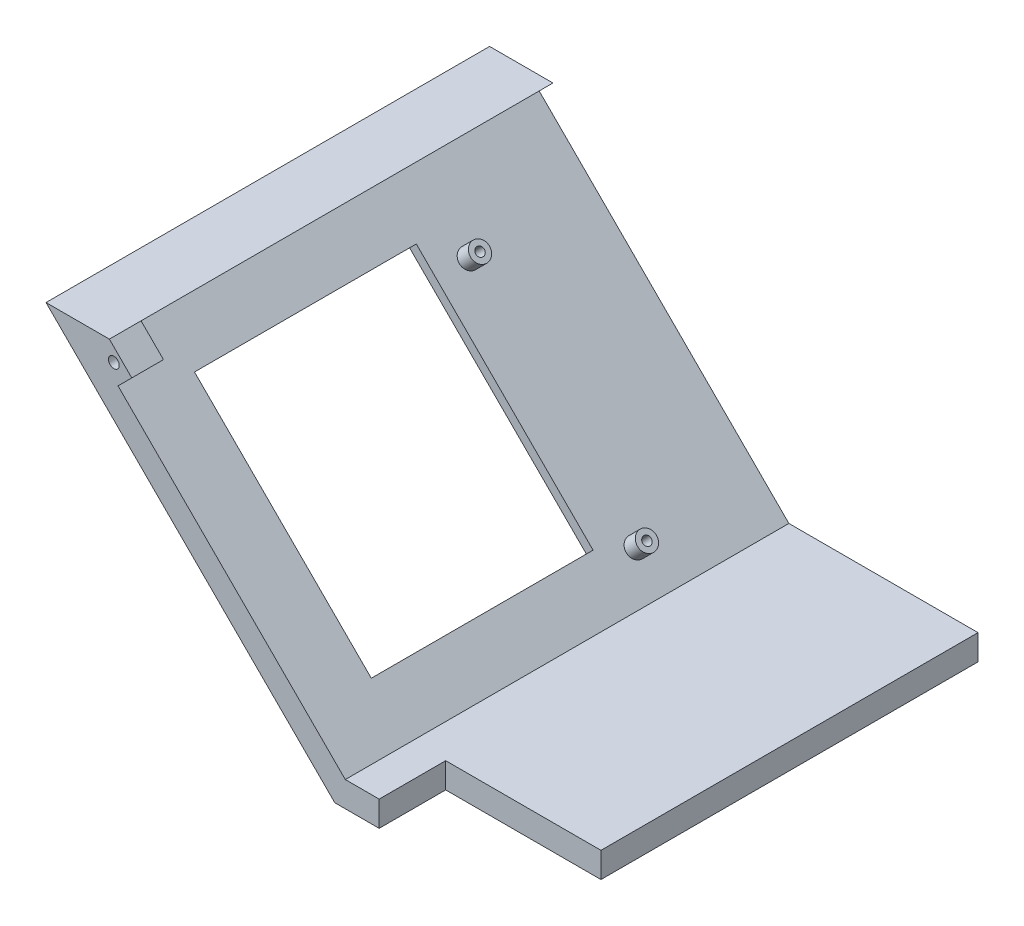
ISO-10303-21;
HEADER;
FILE_DESCRIPTION(('STEP AP214'),'2;1');
FILE_NAME('part.step','',(''),(''),'','','');
FILE_SCHEMA(('AUTOMOTIVE_DESIGN { 1 0 10303 214 1 1 1 1 }'));
ENDSEC;
DATA;
#1=APPLICATION_CONTEXT('core data for automotive mechanical design processes');
#2=APPLICATION_PROTOCOL_DEFINITION('international standard','automotive_design',2000,#1);
#3=PRODUCT_CONTEXT('',#1,'mechanical');
#4=PRODUCT('Part','Part','',(#3));
#5=PRODUCT_RELATED_PRODUCT_CATEGORY('part','',(#4));
#6=PRODUCT_DEFINITION_FORMATION('','',#4);
#7=PRODUCT_DEFINITION_CONTEXT('part definition',#1,'design');
#8=PRODUCT_DEFINITION('design','',#6,#7);
#9=PRODUCT_DEFINITION_SHAPE('','',#8);
#10=(LENGTH_UNIT() NAMED_UNIT(*) SI_UNIT(.MILLI.,.METRE.));
#11=(NAMED_UNIT(*) PLANE_ANGLE_UNIT() SI_UNIT($,.RADIAN.));
#12=(NAMED_UNIT(*) SI_UNIT($,.STERADIAN.) SOLID_ANGLE_UNIT());
#13=UNCERTAINTY_MEASURE_WITH_UNIT(LENGTH_MEASURE(1.E-05),#10,'distance_accuracy_value','');
#14=(GEOMETRIC_REPRESENTATION_CONTEXT(3) GLOBAL_UNCERTAINTY_ASSIGNED_CONTEXT((#13)) GLOBAL_UNIT_ASSIGNED_CONTEXT((#10,
#11,#12)) REPRESENTATION_CONTEXT('',''));
#15=CARTESIAN_POINT('',(0.,0.,0.));
#16=DIRECTION('',(0.,0.,1.));
#17=DIRECTION('',(1.,0.,0.));
#18=AXIS2_PLACEMENT_3D('',#15,#16,#17);
#19=CARTESIAN_POINT('',(0.,0.,130.));
#20=DIRECTION('',(0.,0.,1.));
#21=DIRECTION('',(1.,0.,0.));
#22=AXIS2_PLACEMENT_3D('',#19,#20,#21);
#23=PLANE('',#22);
#24=DIRECTION('',(-0.707106781186548,0.707106781186547,0.));
#25=VECTOR('',#24,1.);
#26=CARTESIAN_POINT('',(-127.078932188135,84.0789321881348,130.));
#27=LINE('',#26,#25);
#28=CARTESIAN_POINT('',(-130.614466094067,87.6144660940676,130.));
#29=VERTEX_POINT('',#28);
#30=CARTESIAN_POINT('',(-134.15,91.1500000000003,130.));
#31=VERTEX_POINT('',#30);
#32=EDGE_CURVE('E254',#29,#31,#27,.T.);
#33=ORIENTED_EDGE('',*,*,#32,.F.);
#34=CARTESIAN_POINT('',(-132.735786437627,85.4931457505079,130.));
#35=DIRECTION('',(0.,0.,-1.));
#36=DIRECTION('',(-1.,0.,0.));
#37=AXIS2_PLACEMENT_3D('',#34,#35,#36);
#38=CIRCLE('',#37,3.);
#39=EDGE_CURVE('E241',#29,#29,#38,.T.);
#40=ORIENTED_EDGE('',*,*,#39,.F.);
#41=CARTESIAN_POINT('',(-127.078932188135,84.0789321881348,130.));
#42=VERTEX_POINT('',#41);
#43=EDGE_CURVE('E250',#42,#29,#27,.T.);
#44=ORIENTED_EDGE('',*,*,#43,.F.);
#45=DIRECTION('',(0.707106781186549,0.707106781186546,0.));
#46=VECTOR('',#45,1.);
#47=CARTESIAN_POINT('',(-131.422077938642,79.7357864376271,130.));
#48=LINE('',#47,#46);
#49=CARTESIAN_POINT('',(-131.422077938642,79.7357864376271,130.));
#50=VERTEX_POINT('',#49);
#51=EDGE_CURVE('E260',#50,#42,#48,.T.);
#52=ORIENTED_EDGE('',*,*,#51,.F.);
#53=DIRECTION('',(0.707106781186534,-0.707106781186561,0.));
#54=VECTOR('',#53,1.);
#55=CARTESIAN_POINT('',(-138.493145750508,86.8068542494927,130.));
#56=LINE('',#55,#54);
#57=CARTESIAN_POINT('',(-138.493145750508,86.8068542494927,130.));
#58=VERTEX_POINT('',#57);
#59=EDGE_CURVE('E257',#58,#50,#56,.T.);
#60=ORIENTED_EDGE('',*,*,#59,.F.);
#61=DIRECTION('',(-0.707106781186544,-0.707106781186551,0.));
#62=VECTOR('',#61,1.);
#63=CARTESIAN_POINT('',(-134.15,91.1500000000003,130.));
#64=LINE('',#63,#62);
#65=EDGE_CURVE('E253',#31,#58,#64,.T.);
#66=ORIENTED_EDGE('',*,*,#65,.F.);
#67=EDGE_LOOP('',(#33,#40,#44,#52,#60,#66));
#68=FACE_BOUND('',#67,.T.);
#69=ADVANCED_FACE('F32',(#68),#23,.F.);
#70=CARTESIAN_POINT('',(-134.15,91.1500000000003,140.));
#71=DIRECTION('',(-0.707106781186551,0.707106781186544,0.));
#72=DIRECTION('',(-0.707106781186544,-0.707106781186551,0.));
#73=AXIS2_PLACEMENT_3D('',#70,#71,#72);
#74=PLANE('',#73);
#75=ORIENTED_EDGE('',*,*,#65,.T.);
#76=DIRECTION('',(0.,0.,-1.));
#77=VECTOR('',#76,1.);
#78=CARTESIAN_POINT('',(-138.493145750508,86.8068542494927,140.));
#79=LINE('',#78,#77);
#80=CARTESIAN_POINT('',(-138.493145750508,86.8068542494927,0.));
#81=VERTEX_POINT('',#80);
#82=EDGE_CURVE('E325',#58,#81,#79,.T.);
#83=ORIENTED_EDGE('',*,*,#82,.T.);
#84=DIRECTION('',(0.707106781186544,0.707106781186551,0.));
#85=VECTOR('',#84,1.);
#86=CARTESIAN_POINT('',(-134.15,91.1500000000003,0.));
#87=LINE('',#86,#85);
#88=CARTESIAN_POINT('',(-134.15,91.1500000000003,0.));
#89=VERTEX_POINT('',#88);
#90=EDGE_CURVE('E310',#81,#89,#87,.T.);
#91=ORIENTED_EDGE('',*,*,#90,.T.);
#92=DIRECTION('',(0.,0.,-1.));
#93=VECTOR('',#92,1.);
#94=CARTESIAN_POINT('',(-134.15,91.1500000000003,140.));
#95=LINE('',#94,#93);
#96=EDGE_CURVE('E321',#31,#89,#95,.T.);
#97=ORIENTED_EDGE('',*,*,#96,.F.);
#98=EDGE_LOOP('',(#75,#83,#91,#97));
#99=FACE_BOUND('',#98,.T.);
#100=ADVANCED_FACE('F362',(#99),#74,.F.);
#101=CARTESIAN_POINT('',(-63.,0.,140.));
#102=DIRECTION('',(0.,1.,0.));
#103=DIRECTION('',(0.,0.,1.));
#104=AXIS2_PLACEMENT_3D('',#101,#102,#103);
#105=PLANE('',#104);
#106=DIRECTION('',(0.,0.,-1.));
#107=VECTOR('',#106,1.);
#108=CARTESIAN_POINT('',(0.,0.,140.));
#109=LINE('',#108,#107);
#110=CARTESIAN_POINT('',(0.,0.,119.));
#111=VERTEX_POINT('',#110);
#112=CARTESIAN_POINT('',(0.,0.,0.));
#113=VERTEX_POINT('',#112);
#114=EDGE_CURVE('E332',#111,#113,#109,.T.);
#115=ORIENTED_EDGE('',*,*,#114,.F.);
#116=DIRECTION('',(1.,0.,0.));
#117=VECTOR('',#116,1.);
#118=CARTESIAN_POINT('',(0.,0.,119.));
#119=LINE('',#118,#117);
#120=CARTESIAN_POINT('',(-49.,0.,119.));
#121=VERTEX_POINT('',#120);
#122=EDGE_CURVE('E275',#121,#111,#119,.T.);
#123=ORIENTED_EDGE('',*,*,#122,.F.);
#124=DIRECTION('',(0.,0.,-1.));
#125=VECTOR('',#124,1.);
#126=CARTESIAN_POINT('',(-49.,0.,140.));
#127=LINE('',#126,#125);
#128=CARTESIAN_POINT('',(-49.,0.,140.));
#129=VERTEX_POINT('',#128);
#130=EDGE_CURVE('E270',#129,#121,#127,.T.);
#131=ORIENTED_EDGE('',*,*,#130,.F.);
#132=DIRECTION('',(1.,0.,0.));
#133=VECTOR('',#132,1.);
#134=CARTESIAN_POINT('',(-63.,0.,140.));
#135=LINE('',#134,#133);
#136=CARTESIAN_POINT('',(-63.,0.,140.));
#137=VERTEX_POINT('',#136);
#138=EDGE_CURVE('E286',#137,#129,#135,.T.);
#139=ORIENTED_EDGE('',*,*,#138,.F.);
#140=DIRECTION('',(0.,0.,-1.));
#141=VECTOR('',#140,1.);
#142=CARTESIAN_POINT('',(-63.,0.,140.));
#143=LINE('',#142,#141);
#144=CARTESIAN_POINT('',(-63.,0.,0.));
#145=VERTEX_POINT('',#144);
#146=EDGE_CURVE('E299',#137,#145,#143,.T.);
#147=ORIENTED_EDGE('',*,*,#146,.T.);
#148=DIRECTION('',(1.,0.,0.));
#149=VECTOR('',#148,1.);
#150=CARTESIAN_POINT('',(-63.,0.,0.));
#151=LINE('',#150,#149);
#152=EDGE_CURVE('E285',#145,#113,#151,.T.);
#153=ORIENTED_EDGE('',*,*,#152,.T.);
#154=EDGE_LOOP('',(#115,#123,#131,#139,#147,#153));
#155=FACE_BOUND('',#154,.T.);
#156=ADVANCED_FACE('F34',(#155),#105,.F.);
#157=CARTESIAN_POINT('',(0.,0.,140.));
#158=DIRECTION('',(-1.,0.,0.));
#159=DIRECTION('',(0.,0.,1.));
#160=AXIS2_PLACEMENT_3D('',#157,#158,#159);
#161=PLANE('',#160);
#162=DIRECTION('',(0.,0.,-1.));
#163=VECTOR('',#162,1.);
#164=CARTESIAN_POINT('',(0.,8.,140.));
#165=LINE('',#164,#163);
#166=CARTESIAN_POINT('',(0.,7.99999999999999,119.));
#167=VERTEX_POINT('',#166);
#168=CARTESIAN_POINT('',(0.,8.,0.));
#169=VERTEX_POINT('',#168);
#170=EDGE_CURVE('E330',#167,#169,#165,.T.);
#171=ORIENTED_EDGE('',*,*,#170,.F.);
#172=DIRECTION('',(0.,-1.,0.));
#173=VECTOR('',#172,1.);
#174=CARTESIAN_POINT('',(0.,91.1500000000003,119.));
#175=LINE('',#174,#173);
#176=EDGE_CURVE('E278',#167,#111,#175,.T.);
#177=ORIENTED_EDGE('',*,*,#176,.T.);
#178=ORIENTED_EDGE('',*,*,#114,.T.);
#179=DIRECTION('',(0.,1.,0.));
#180=VECTOR('',#179,1.);
#181=CARTESIAN_POINT('',(0.,0.,0.));
#182=LINE('',#181,#180);
#183=EDGE_CURVE('E302',#113,#169,#182,.T.);
#184=ORIENTED_EDGE('',*,*,#183,.T.);
#185=EDGE_LOOP('',(#171,#177,#178,#184));
#186=FACE_BOUND('',#185,.T.);
#187=ADVANCED_FACE('F427',(#186),#161,.F.);
#188=CARTESIAN_POINT('',(0.,8.,140.));
#189=DIRECTION('',(0.,-1.,0.));
#190=DIRECTION('',(1.,0.,0.));
#191=AXIS2_PLACEMENT_3D('',#188,#189,#190);
#192=PLANE('',#191);
#193=DIRECTION('',(0.,0.,-1.));
#194=VECTOR('',#193,1.);
#195=CARTESIAN_POINT('',(-49.,7.99999999999999,140.));
#196=LINE('',#195,#194);
#197=CARTESIAN_POINT('',(-49.,7.99999999999999,140.));
#198=VERTEX_POINT('',#197);
#199=CARTESIAN_POINT('',(-49.,7.99999999999999,119.));
#200=VERTEX_POINT('',#199);
#201=EDGE_CURVE('E281',#198,#200,#196,.T.);
#202=ORIENTED_EDGE('',*,*,#201,.T.);
#203=DIRECTION('',(1.,0.,0.));
#204=VECTOR('',#203,1.);
#205=CARTESIAN_POINT('',(0.,8.,119.));
#206=LINE('',#205,#204);
#207=EDGE_CURVE('E336',#200,#167,#206,.T.);
#208=ORIENTED_EDGE('',*,*,#207,.T.);
#209=ORIENTED_EDGE('',*,*,#170,.T.);
#210=DIRECTION('',(-1.,0.,0.));
#211=VECTOR('',#210,1.);
#212=CARTESIAN_POINT('',(0.,8.,0.));
#213=LINE('',#212,#211);
#214=CARTESIAN_POINT('',(-59.6862915010152,7.99999999999999,0.));
#215=VERTEX_POINT('',#214);
#216=EDGE_CURVE('E305',#169,#215,#213,.T.);
#217=ORIENTED_EDGE('',*,*,#216,.T.);
#218=DIRECTION('',(0.,0.,-1.));
#219=VECTOR('',#218,1.);
#220=CARTESIAN_POINT('',(-59.6862915010152,7.99999999999999,140.));
#221=LINE('',#220,#219);
#222=CARTESIAN_POINT('',(-59.6862915010152,7.99999999999999,140.));
#223=VERTEX_POINT('',#222);
#224=EDGE_CURVE('E327',#223,#215,#221,.T.);
#225=ORIENTED_EDGE('',*,*,#224,.F.);
#226=DIRECTION('',(-1.,0.,0.));
#227=VECTOR('',#226,1.);
#228=CARTESIAN_POINT('',(0.,8.,140.));
#229=LINE('',#228,#227);
#230=EDGE_CURVE('E289',#198,#223,#229,.T.);
#231=ORIENTED_EDGE('',*,*,#230,.F.);
#232=EDGE_LOOP('',(#202,#208,#209,#217,#225,#231));
#233=FACE_BOUND('',#232,.T.);
#234=ADVANCED_FACE('F349',(#233),#192,.F.);
#235=CARTESIAN_POINT('',(-59.6862915010152,7.99999999999999,140.));
#236=DIRECTION('',(-0.707106781186549,-0.707106781186546,0.));
#237=DIRECTION('',(0.707106781186546,-0.707106781186549,0.));
#238=AXIS2_PLACEMENT_3D('',#235,#236,#237);
#239=PLANE('',#238);
#240=CARTESIAN_POINT('',(-121.204581464245,69.5182899632297,39.5));
#241=DIRECTION('',(-0.707106781186549,-0.707106781186546,0.));
#242=DIRECTION('',(0.707106781186546,-0.707106781186549,0.));
#243=AXIS2_PLACEMENT_3D('',#240,#241,#242);
#244=CIRCLE('',#243,3.);
#245=CARTESIAN_POINT('',(-119.083261120685,67.3969696196701,39.5));
#246=VERTEX_POINT('',#245);
#247=EDGE_CURVE('E11',#246,#246,#244,.F.);
#248=ORIENTED_EDGE('',*,*,#247,.F.);
#249=EDGE_LOOP('',(#248));
#250=FACE_BOUND('',#249,.T.);
#251=CARTESIAN_POINT('',(-68.525126265847,16.8388347648318,39.5));
#252=DIRECTION('',(-0.707106781186549,-0.707106781186546,0.));
#253=DIRECTION('',(0.707106781186546,-0.707106781186549,0.));
#254=AXIS2_PLACEMENT_3D('',#251,#252,#253);
#255=CIRCLE('',#254,3.);
#256=CARTESIAN_POINT('',(-66.4038059222874,14.7175144212722,39.5));
#257=VERTEX_POINT('',#256);
#258=EDGE_CURVE('E40',#257,#257,#255,.F.);
#259=ORIENTED_EDGE('',*,*,#258,.F.);
#260=EDGE_LOOP('',(#259));
#261=FACE_BOUND('',#260,.T.);
#262=DIRECTION('',(0.,0.,1.));
#263=VECTOR('',#262,1.);
#264=CARTESIAN_POINT('',(-71.4852813742385,19.7989898732234,140.));
#265=LINE('',#264,#263);
#266=CARTESIAN_POINT('',(-71.4852813742385,19.7989898732233,50.));
#267=VERTEX_POINT('',#266);
#268=CARTESIAN_POINT('',(-71.4852813742385,19.7989898732233,120.));
#269=VERTEX_POINT('',#268);
#270=EDGE_CURVE('E235',#267,#269,#265,.T.);
#271=ORIENTED_EDGE('',*,*,#270,.T.);
#272=DIRECTION('',(-0.707106781186546,0.707106781186549,0.));
#273=VECTOR('',#272,1.);
#274=CARTESIAN_POINT('',(-59.6862915010152,7.99999999999999,120.));
#275=LINE('',#274,#273);
#276=CARTESIAN_POINT('',(-127.279942314911,75.5936508138962,120.));
#277=VERTEX_POINT('',#276);
#278=EDGE_CURVE('E238',#269,#277,#275,.T.);
#279=ORIENTED_EDGE('',*,*,#278,.T.);
#280=DIRECTION('',(0.,0.,-1.));
#281=VECTOR('',#280,1.);
#282=CARTESIAN_POINT('',(-127.279942314911,75.5936508138962,140.));
#283=LINE('',#282,#281);
#284=CARTESIAN_POINT('',(-127.279942314911,75.5936508138962,50.));
#285=VERTEX_POINT('',#284);
#286=EDGE_CURVE('E221',#277,#285,#283,.T.);
#287=ORIENTED_EDGE('',*,*,#286,.T.);
#288=DIRECTION('',(0.707106781186546,-0.707106781186549,0.));
#289=VECTOR('',#288,1.);
#290=CARTESIAN_POINT('',(-59.6862915010152,7.99999999999998,50.));
#291=LINE('',#290,#289);
#292=EDGE_CURVE('E232',#285,#267,#291,.T.);
#293=ORIENTED_EDGE('',*,*,#292,.T.);
#294=EDGE_LOOP('',(#271,#279,#287,#293));
#295=FACE_BOUND('',#294,.T.);
#296=ORIENTED_EDGE('',*,*,#59,.T.);
#297=DIRECTION('',(0.,0.,1.));
#298=VECTOR('',#297,1.);
#299=CARTESIAN_POINT('',(-131.422077938642,79.7357864376271,130.));
#300=LINE('',#299,#298);
#301=CARTESIAN_POINT('',(-131.422077938642,79.7357864376271,140.));
#302=VERTEX_POINT('',#301);
#303=EDGE_CURVE('E263',#50,#302,#300,.T.);
#304=ORIENTED_EDGE('',*,*,#303,.T.);
#305=DIRECTION('',(-0.707106781186546,0.707106781186549,0.));
#306=VECTOR('',#305,1.);
#307=CARTESIAN_POINT('',(-59.6862915010152,7.99999999999999,140.));
#308=LINE('',#307,#306);
#309=EDGE_CURVE('E292',#223,#302,#308,.T.);
#310=ORIENTED_EDGE('',*,*,#309,.F.);
#311=ORIENTED_EDGE('',*,*,#224,.T.);
#312=DIRECTION('',(-0.707106781186546,0.707106781186549,0.));
#313=VECTOR('',#312,1.);
#314=CARTESIAN_POINT('',(-59.6862915010152,7.99999999999999,0.));
#315=LINE('',#314,#313);
#316=EDGE_CURVE('E307',#215,#81,#315,.T.);
#317=ORIENTED_EDGE('',*,*,#316,.T.);
#318=ORIENTED_EDGE('',*,*,#82,.F.);
#319=EDGE_LOOP('',(#296,#304,#310,#311,#317,#318));
#320=FACE_BOUND('',#319,.T.);
#321=ADVANCED_FACE('F345',(#250,#261,#295,#320),#239,.F.);
#322=CARTESIAN_POINT('',(-154.15,91.1500000000003,140.));
#323=DIRECTION('',(0.,-1.,0.));
#324=DIRECTION('',(1.,0.,0.));
#325=AXIS2_PLACEMENT_3D('',#322,#323,#324);
#326=PLANE('',#325);
#327=DIRECTION('',(-1.,0.,0.));
#328=VECTOR('',#327,1.);
#329=CARTESIAN_POINT('',(-154.15,91.1500000000003,0.));
#330=LINE('',#329,#328);
#331=CARTESIAN_POINT('',(-154.15,91.1500000000003,0.));
#332=VERTEX_POINT('',#331);
#333=EDGE_CURVE('E313',#89,#332,#330,.T.);
#334=ORIENTED_EDGE('',*,*,#333,.T.);
#335=DIRECTION('',(0.,0.,-1.));
#336=VECTOR('',#335,1.);
#337=CARTESIAN_POINT('',(-154.15,91.1500000000003,140.));
#338=LINE('',#337,#336);
#339=CARTESIAN_POINT('',(-154.15,91.1500000000003,140.));
#340=VERTEX_POINT('',#339);
#341=EDGE_CURVE('E318',#340,#332,#338,.T.);
#342=ORIENTED_EDGE('',*,*,#341,.F.);
#343=DIRECTION('',(-1.,0.,0.));
#344=VECTOR('',#343,1.);
#345=CARTESIAN_POINT('',(-154.15,91.1500000000003,140.));
#346=LINE('',#345,#344);
#347=CARTESIAN_POINT('',(-134.15,91.1500000000003,140.));
#348=VERTEX_POINT('',#347);
#349=EDGE_CURVE('E295',#348,#340,#346,.T.);
#350=ORIENTED_EDGE('',*,*,#349,.F.);
#351=EDGE_CURVE('E322',#348,#31,#95,.T.);
#352=ORIENTED_EDGE('',*,*,#351,.T.);
#353=ORIENTED_EDGE('',*,*,#96,.T.);
#354=EDGE_LOOP('',(#334,#342,#350,#352,#353));
#355=FACE_BOUND('',#354,.T.);
#356=ADVANCED_FACE('F348',(#355),#326,.F.);
#357=CARTESIAN_POINT('',(-154.15,91.1500000000003,140.));
#358=DIRECTION('',(0.707106781186549,0.707106781186546,0.));
#359=DIRECTION('',(-0.707106781186546,0.707106781186549,0.));
#360=AXIS2_PLACEMENT_3D('',#357,#358,#359);
#361=PLANE('',#360);
#362=CARTESIAN_POINT('',(-126.861435713737,63.8614357137373,39.5));
#363=DIRECTION('',(0.707106781186549,0.707106781186546,0.));
#364=DIRECTION('',(-0.707106781186546,0.707106781186549,0.));
#365=AXIS2_PLACEMENT_3D('',#362,#363,#364);
#366=CIRCLE('',#365,1.35);
#367=CARTESIAN_POINT('',(-127.816029868339,64.8160298683392,39.5));
#368=VERTEX_POINT('',#367);
#369=EDGE_CURVE('E677',#368,#368,#366,.T.);
#370=ORIENTED_EDGE('',*,*,#369,.T.);
#371=EDGE_LOOP('',(#370));
#372=FACE_BOUND('',#371,.T.);
#373=CARTESIAN_POINT('',(-74.1819805153394,11.1819805153395,39.5));
#374=DIRECTION('',(0.707106781186549,0.707106781186546,0.));
#375=DIRECTION('',(-0.707106781186546,0.707106781186549,0.));
#376=AXIS2_PLACEMENT_3D('',#373,#374,#375);
#377=CIRCLE('',#376,1.35);
#378=CARTESIAN_POINT('',(-75.1365746699413,12.1365746699413,39.5));
#379=VERTEX_POINT('',#378);
#380=EDGE_CURVE('E681',#379,#379,#377,.T.);
#381=ORIENTED_EDGE('',*,*,#380,.T.);
#382=EDGE_LOOP('',(#381));
#383=FACE_BOUND('',#382,.T.);
#384=DIRECTION('',(0.,0.,-1.));
#385=VECTOR('',#384,1.);
#386=CARTESIAN_POINT('',(-138.593650813896,75.5936508138963,128.));
#387=LINE('',#386,#385);
#388=CARTESIAN_POINT('',(-138.593650813896,75.5936508138963,128.));
#389=VERTEX_POINT('',#388);
#390=CARTESIAN_POINT('',(-138.593650813896,75.5936508138963,42.));
#391=VERTEX_POINT('',#390);
#392=EDGE_CURVE('E201',#389,#391,#387,.T.);
#393=ORIENTED_EDGE('',*,*,#392,.F.);
#394=DIRECTION('',(-0.707106781186547,0.707106781186549,0.));
#395=VECTOR('',#394,1.);
#396=CARTESIAN_POINT('',(-138.593650813896,75.5936508138963,128.));
#397=LINE('',#396,#395);
#398=CARTESIAN_POINT('',(-71.4852813742385,8.48528137423858,128.));
#399=VERTEX_POINT('',#398);
#400=EDGE_CURVE('E47',#399,#389,#397,.T.);
#401=ORIENTED_EDGE('',*,*,#400,.F.);
#402=DIRECTION('',(0.,0.,1.));
#403=VECTOR('',#402,1.);
#404=CARTESIAN_POINT('',(-71.4852813742385,8.48528137423858,128.));
#405=LINE('',#404,#403);
#406=CARTESIAN_POINT('',(-71.4852813742385,8.48528137423855,42.));
#407=VERTEX_POINT('',#406);
#408=EDGE_CURVE('E189',#407,#399,#405,.T.);
#409=ORIENTED_EDGE('',*,*,#408,.F.);
#410=DIRECTION('',(0.707106781186546,-0.707106781186549,0.));
#411=VECTOR('',#410,1.);
#412=CARTESIAN_POINT('',(-138.593650813896,75.5936508138963,42.));
#413=LINE('',#412,#411);
#414=EDGE_CURVE('E192',#391,#407,#413,.T.);
#415=ORIENTED_EDGE('',*,*,#414,.F.);
#416=EDGE_LOOP('',(#393,#401,#409,#415));
#417=FACE_BOUND('',#416,.T.);
#418=DIRECTION('',(0.707106781186546,-0.707106781186549,0.));
#419=VECTOR('',#418,1.);
#420=CARTESIAN_POINT('',(-154.15,91.1500000000003,0.));
#421=LINE('',#420,#419);
#422=EDGE_CURVE('E290',#332,#145,#421,.T.);
#423=ORIENTED_EDGE('',*,*,#422,.T.);
#424=ORIENTED_EDGE('',*,*,#146,.F.);
#425=DIRECTION('',(0.707106781186546,-0.707106781186549,0.));
#426=VECTOR('',#425,1.);
#427=CARTESIAN_POINT('',(-154.15,91.1500000000003,140.));
#428=LINE('',#427,#426);
#429=EDGE_CURVE('E297',#340,#137,#428,.T.);
#430=ORIENTED_EDGE('',*,*,#429,.F.);
#431=ORIENTED_EDGE('',*,*,#341,.T.);
#432=EDGE_LOOP('',(#423,#424,#430,#431));
#433=FACE_BOUND('',#432,.T.);
#434=ADVANCED_FACE('F416',(#372,#383,#417,#433),#361,.F.);
#435=CARTESIAN_POINT('',(0.,0.,140.));
#436=DIRECTION('',(0.,0.,1.));
#437=DIRECTION('',(1.,0.,0.));
#438=AXIS2_PLACEMENT_3D('',#435,#436,#437);
#439=PLANE('',#438);
#440=CARTESIAN_POINT('',(-132.735786437627,85.4931457505079,140.));
#441=DIRECTION('',(0.,0.,1.));
#442=DIRECTION('',(1.,0.,0.));
#443=AXIS2_PLACEMENT_3D('',#440,#441,#442);
#444=CIRCLE('',#443,1.70000000000001);
#445=CARTESIAN_POINT('',(-131.035786437627,85.4931457505079,140.));
#446=VERTEX_POINT('',#445);
#447=EDGE_CURVE('E246',#446,#446,#444,.T.);
#448=ORIENTED_EDGE('',*,*,#447,.F.);
#449=EDGE_LOOP('',(#448));
#450=FACE_BOUND('',#449,.T.);
#451=ORIENTED_EDGE('',*,*,#309,.T.);
#452=DIRECTION('',(0.707106781186549,0.707106781186546,0.));
#453=VECTOR('',#452,1.);
#454=CARTESIAN_POINT('',(-131.422077938642,79.7357864376271,140.));
#455=LINE('',#454,#453);
#456=CARTESIAN_POINT('',(-127.078932188135,84.0789321881348,140.));
#457=VERTEX_POINT('',#456);
#458=EDGE_CURVE('E265',#302,#457,#455,.T.);
#459=ORIENTED_EDGE('',*,*,#458,.T.);
#460=DIRECTION('',(-0.707106781186548,0.707106781186547,0.));
#461=VECTOR('',#460,1.);
#462=CARTESIAN_POINT('',(-127.078932188135,84.0789321881348,140.));
#463=LINE('',#462,#461);
#464=EDGE_CURVE('E249',#457,#348,#463,.T.);
#465=ORIENTED_EDGE('',*,*,#464,.T.);
#466=ORIENTED_EDGE('',*,*,#349,.T.);
#467=ORIENTED_EDGE('',*,*,#429,.T.);
#468=ORIENTED_EDGE('',*,*,#138,.T.);
#469=DIRECTION('',(0.,-1.,0.));
#470=VECTOR('',#469,1.);
#471=CARTESIAN_POINT('',(-49.,0.,140.));
#472=LINE('',#471,#470);
#473=EDGE_CURVE('E334',#198,#129,#472,.T.);
#474=ORIENTED_EDGE('',*,*,#473,.F.);
#475=ORIENTED_EDGE('',*,*,#230,.T.);
#476=EDGE_LOOP('',(#451,#459,#465,#466,#467,#468,#474,#475));
#477=FACE_BOUND('',#476,.T.);
#478=ADVANCED_FACE('F414',(#450,#477),#439,.T.);
#479=CARTESIAN_POINT('',(0.,0.,0.));
#480=DIRECTION('',(0.,0.,1.));
#481=DIRECTION('',(1.,0.,0.));
#482=AXIS2_PLACEMENT_3D('',#479,#480,#481);
#483=PLANE('',#482);
#484=ORIENTED_EDGE('',*,*,#152,.F.);
#485=ORIENTED_EDGE('',*,*,#422,.F.);
#486=ORIENTED_EDGE('',*,*,#333,.F.);
#487=ORIENTED_EDGE('',*,*,#90,.F.);
#488=ORIENTED_EDGE('',*,*,#316,.F.);
#489=ORIENTED_EDGE('',*,*,#216,.F.);
#490=ORIENTED_EDGE('',*,*,#183,.F.);
#491=EDGE_LOOP('',(#484,#485,#486,#487,#488,#489,#490));
#492=FACE_BOUND('',#491,.T.);
#493=ADVANCED_FACE('F409',(#492),#483,.F.);
#494=CARTESIAN_POINT('',(0.,91.1500000000003,119.));
#495=DIRECTION('',(0.,0.,-1.));
#496=DIRECTION('',(-1.,0.,0.));
#497=AXIS2_PLACEMENT_3D('',#494,#495,#496);
#498=PLANE('',#497);
#499=DIRECTION('',(0.,-1.,0.));
#500=VECTOR('',#499,1.);
#501=CARTESIAN_POINT('',(-49.,91.1500000000003,119.));
#502=LINE('',#501,#500);
#503=EDGE_CURVE('E277',#200,#121,#502,.T.);
#504=ORIENTED_EDGE('',*,*,#503,.T.);
#505=ORIENTED_EDGE('',*,*,#122,.T.);
#506=ORIENTED_EDGE('',*,*,#176,.F.);
#507=ORIENTED_EDGE('',*,*,#207,.F.);
#508=EDGE_LOOP('',(#504,#505,#506,#507));
#509=FACE_BOUND('',#508,.T.);
#510=ADVANCED_FACE('F406',(#509),#498,.F.);
#511=CARTESIAN_POINT('',(-49.,91.1500000000003,140.));
#512=DIRECTION('',(-1.,0.,0.));
#513=DIRECTION('',(0.,0.,1.));
#514=AXIS2_PLACEMENT_3D('',#511,#512,#513);
#515=PLANE('',#514);
#516=ORIENTED_EDGE('',*,*,#473,.T.);
#517=ORIENTED_EDGE('',*,*,#130,.T.);
#518=ORIENTED_EDGE('',*,*,#503,.F.);
#519=ORIENTED_EDGE('',*,*,#201,.F.);
#520=EDGE_LOOP('',(#516,#517,#518,#519));
#521=FACE_BOUND('',#520,.T.);
#522=ADVANCED_FACE('F405',(#521),#515,.F.);
#523=CARTESIAN_POINT('',(-127.078932188135,84.0789321881348,130.));
#524=DIRECTION('',(0.707106781186547,0.707106781186548,0.));
#525=DIRECTION('',(-0.707106781186548,0.707106781186547,0.));
#526=AXIS2_PLACEMENT_3D('',#523,#524,#525);
#527=PLANE('',#526);
#528=ORIENTED_EDGE('',*,*,#464,.F.);
#529=DIRECTION('',(0.,0.,1.));
#530=VECTOR('',#529,1.);
#531=CARTESIAN_POINT('',(-127.078932188135,84.0789321881348,130.));
#532=LINE('',#531,#530);
#533=EDGE_CURVE('E268',#42,#457,#532,.T.);
#534=ORIENTED_EDGE('',*,*,#533,.F.);
#535=ORIENTED_EDGE('',*,*,#43,.T.);
#536=ORIENTED_EDGE('',*,*,#32,.T.);
#537=ORIENTED_EDGE('',*,*,#351,.F.);
#538=EDGE_LOOP('',(#528,#534,#535,#536,#537));
#539=FACE_BOUND('',#538,.T.);
#540=ADVANCED_FACE('F371',(#539),#527,.T.);
#541=CARTESIAN_POINT('',(-131.422077938642,79.7357864376271,130.));
#542=DIRECTION('',(0.707106781186546,-0.707106781186549,0.));
#543=DIRECTION('',(0.707106781186549,0.707106781186546,0.));
#544=AXIS2_PLACEMENT_3D('',#541,#542,#543);
#545=PLANE('',#544);
#546=ORIENTED_EDGE('',*,*,#458,.F.);
#547=ORIENTED_EDGE('',*,*,#303,.F.);
#548=ORIENTED_EDGE('',*,*,#51,.T.);
#549=ORIENTED_EDGE('',*,*,#533,.T.);
#550=EDGE_LOOP('',(#546,#547,#548,#549));
#551=FACE_BOUND('',#550,.T.);
#552=ADVANCED_FACE('F387',(#551),#545,.T.);
#553=CARTESIAN_POINT('',(-132.735786437627,85.4931457505079,130.));
#554=DIRECTION('',(0.,0.,-1.));
#555=DIRECTION('',(-1.,0.,0.));
#556=AXIS2_PLACEMENT_3D('',#553,#554,#555);
#557=CYLINDRICAL_SURFACE('',#556,1.70000000000001);
#558=CARTESIAN_POINT('',(-132.735786437627,85.4931457505079,131.3));
#559=DIRECTION('',(0.,0.,-1.));
#560=DIRECTION('',(-1.,0.,0.));
#561=AXIS2_PLACEMENT_3D('',#558,#559,#560);
#562=CIRCLE('',#561,1.70000000000001);
#563=CARTESIAN_POINT('',(-134.435786437627,85.4931457505079,131.3));
#564=VERTEX_POINT('',#563);
#565=EDGE_CURVE('E243',#564,#564,#562,.T.);
#566=ORIENTED_EDGE('',*,*,#565,.T.);
#567=EDGE_LOOP('',(#566));
#568=FACE_BOUND('',#567,.T.);
#569=ORIENTED_EDGE('',*,*,#447,.T.);
#570=EDGE_LOOP('',(#569));
#571=FACE_BOUND('',#570,.T.);
#572=ADVANCED_FACE('F377',(#568,#571),#557,.F.);
#573=CARTESIAN_POINT('',(-132.735786437627,85.4931457505079,130.));
#574=DIRECTION('',(0.,0.,-1.));
#575=DIRECTION('',(-1.,0.,0.));
#576=AXIS2_PLACEMENT_3D('',#573,#574,#575);
#577=CONICAL_SURFACE('',#576,3.,0.785398163397448);
#578=ORIENTED_EDGE('',*,*,#565,.F.);
#579=EDGE_LOOP('',(#578));
#580=FACE_BOUND('',#579,.T.);
#581=ORIENTED_EDGE('',*,*,#39,.T.);
#582=EDGE_LOOP('',(#581));
#583=FACE_BOUND('',#582,.T.);
#584=ADVANCED_FACE('F374',(#580,#583),#577,.F.);
#585=CARTESIAN_POINT('',(-55.8617965644034,147.011796564404,120.));
#586=DIRECTION('',(0.,0.,1.));
#587=DIRECTION('',(0.,-1.,0.));
#588=AXIS2_PLACEMENT_3D('',#585,#586,#587);
#589=PLANE('',#588);
#590=DIRECTION('',(-0.707106781186549,-0.707106781186547,0.));
#591=VECTOR('',#590,1.);
#592=CARTESIAN_POINT('',(-0.0671356237306742,91.217135623731,120.));
#593=LINE('',#592,#591);
#594=CARTESIAN_POINT('',(-73.6066017177982,17.6776695296637,120.));
#595=VERTEX_POINT('',#594);
#596=EDGE_CURVE('E218',#269,#595,#593,.T.);
#597=ORIENTED_EDGE('',*,*,#596,.T.);
#598=DIRECTION('',(-0.707106781186547,0.707106781186549,0.));
#599=VECTOR('',#598,1.);
#600=CARTESIAN_POINT('',(-129.401262658471,73.4723304703366,120.));
#601=LINE('',#600,#599);
#602=CARTESIAN_POINT('',(-129.401262658471,73.4723304703366,120.));
#603=VERTEX_POINT('',#602);
#604=EDGE_CURVE('E214',#595,#603,#601,.T.);
#605=ORIENTED_EDGE('',*,*,#604,.T.);
#606=DIRECTION('',(-0.707106781186549,-0.707106781186547,0.));
#607=VECTOR('',#606,1.);
#608=CARTESIAN_POINT('',(-55.8617965644034,147.011796564404,120.));
#609=LINE('',#608,#607);
#610=EDGE_CURVE('E217',#277,#603,#609,.T.);
#611=ORIENTED_EDGE('',*,*,#610,.F.);
#612=ORIENTED_EDGE('',*,*,#278,.F.);
#613=EDGE_LOOP('',(#597,#605,#611,#612));
#614=FACE_BOUND('',#613,.T.);
#615=ADVANCED_FACE('F376',(#614),#589,.F.);
#616=CARTESIAN_POINT('',(-0.0671356237306742,91.217135623731,120.));
#617=DIRECTION('',(0.707106781186547,-0.707106781186549,0.));
#618=DIRECTION('',(0.707106781186549,0.707106781186546,0.));
#619=AXIS2_PLACEMENT_3D('',#616,#617,#618);
#620=PLANE('',#619);
#621=DIRECTION('',(-0.707106781186549,-0.707106781186547,0.));
#622=VECTOR('',#621,1.);
#623=CARTESIAN_POINT('',(-0.0671356237306603,91.217135623731,50.));
#624=LINE('',#623,#622);
#625=CARTESIAN_POINT('',(-73.6066017177982,17.6776695296637,50.));
#626=VERTEX_POINT('',#625);
#627=EDGE_CURVE('E222',#267,#626,#624,.T.);
#628=ORIENTED_EDGE('',*,*,#627,.T.);
#629=DIRECTION('',(0.,0.,1.));
#630=VECTOR('',#629,1.);
#631=CARTESIAN_POINT('',(-73.6066017177982,17.6776695296637,120.));
#632=LINE('',#631,#630);
#633=EDGE_CURVE('E211',#626,#595,#632,.T.);
#634=ORIENTED_EDGE('',*,*,#633,.T.);
#635=ORIENTED_EDGE('',*,*,#596,.F.);
#636=ORIENTED_EDGE('',*,*,#270,.F.);
#637=EDGE_LOOP('',(#628,#634,#635,#636));
#638=FACE_BOUND('',#637,.T.);
#639=ADVANCED_FACE('F384',(#638),#620,.F.);
#640=CARTESIAN_POINT('',(-55.8617965644034,147.011796564404,50.));
#641=DIRECTION('',(0.,0.,-1.));
#642=DIRECTION('',(0.,1.,0.));
#643=AXIS2_PLACEMENT_3D('',#640,#641,#642);
#644=PLANE('',#643);
#645=DIRECTION('',(-0.707106781186549,-0.707106781186547,0.));
#646=VECTOR('',#645,1.);
#647=CARTESIAN_POINT('',(-55.8617965644034,147.011796564404,50.));
#648=LINE('',#647,#646);
#649=CARTESIAN_POINT('',(-129.401262658471,73.4723304703366,50.));
#650=VERTEX_POINT('',#649);
#651=EDGE_CURVE('E225',#285,#650,#648,.T.);
#652=ORIENTED_EDGE('',*,*,#651,.T.);
#653=DIRECTION('',(0.707106781186547,-0.707106781186549,0.));
#654=VECTOR('',#653,1.);
#655=CARTESIAN_POINT('',(-129.401262658471,73.4723304703366,50.));
#656=LINE('',#655,#654);
#657=EDGE_CURVE('E55',#650,#626,#656,.T.);
#658=ORIENTED_EDGE('',*,*,#657,.T.);
#659=ORIENTED_EDGE('',*,*,#627,.F.);
#660=ORIENTED_EDGE('',*,*,#292,.F.);
#661=EDGE_LOOP('',(#652,#658,#659,#660));
#662=FACE_BOUND('',#661,.T.);
#663=ADVANCED_FACE('F539',(#662),#644,.F.);
#664=CARTESIAN_POINT('',(-55.8617965644034,147.011796564404,120.));
#665=DIRECTION('',(-0.707106781186547,0.707106781186549,0.));
#666=DIRECTION('',(-0.707106781186549,-0.707106781186546,0.));
#667=AXIS2_PLACEMENT_3D('',#664,#665,#666);
#668=PLANE('',#667);
#669=ORIENTED_EDGE('',*,*,#610,.T.);
#670=DIRECTION('',(0.,0.,-1.));
#671=VECTOR('',#670,1.);
#672=CARTESIAN_POINT('',(-129.401262658471,73.4723304703366,120.));
#673=LINE('',#672,#671);
#674=EDGE_CURVE('E339',#603,#650,#673,.T.);
#675=ORIENTED_EDGE('',*,*,#674,.T.);
#676=ORIENTED_EDGE('',*,*,#651,.F.);
#677=ORIENTED_EDGE('',*,*,#286,.F.);
#678=EDGE_LOOP('',(#669,#675,#676,#677));
#679=FACE_BOUND('',#678,.T.);
#680=ADVANCED_FACE('F549',(#679),#668,.F.);
#681=CARTESIAN_POINT('',(-27.9644660940674,-27.9644660940673,0.));
#682=DIRECTION('',(0.707106781186549,0.707106781186547,0.));
#683=DIRECTION('',(-0.707106781186547,0.707106781186549,0.));
#684=AXIS2_PLACEMENT_3D('',#681,#682,#683);
#685=PLANE('',#684);
#686=DIRECTION('',(-0.707106781186547,0.707106781186549,0.));
#687=VECTOR('',#686,1.);
#688=CARTESIAN_POINT('',(-135.058116907963,79.129184719829,128.));
#689=LINE('',#688,#687);
#690=CARTESIAN_POINT('',(-67.9497474683058,12.0208152801713,128.));
#691=VERTEX_POINT('',#690);
#692=CARTESIAN_POINT('',(-135.058116907963,79.129184719829,128.));
#693=VERTEX_POINT('',#692);
#694=EDGE_CURVE('E171',#691,#693,#689,.T.);
#695=ORIENTED_EDGE('',*,*,#694,.T.);
#696=DIRECTION('',(0.,0.,-1.));
#697=VECTOR('',#696,1.);
#698=CARTESIAN_POINT('',(-135.058116907963,79.129184719829,128.));
#699=LINE('',#698,#697);
#700=CARTESIAN_POINT('',(-135.058116907963,79.129184719829,42.));
#701=VERTEX_POINT('',#700);
#702=EDGE_CURVE('E180',#693,#701,#699,.T.);
#703=ORIENTED_EDGE('',*,*,#702,.T.);
#704=DIRECTION('',(0.707106781186546,-0.707106781186549,0.));
#705=VECTOR('',#704,1.);
#706=CARTESIAN_POINT('',(-135.058116907963,79.129184719829,42.));
#707=LINE('',#706,#705);
#708=CARTESIAN_POINT('',(-67.9497474683058,12.0208152801713,42.));
#709=VERTEX_POINT('',#708);
#710=EDGE_CURVE('E185',#701,#709,#707,.T.);
#711=ORIENTED_EDGE('',*,*,#710,.T.);
#712=DIRECTION('',(0.,0.,1.));
#713=VECTOR('',#712,1.);
#714=CARTESIAN_POINT('',(-67.9497474683058,12.0208152801713,128.));
#715=LINE('',#714,#713);
#716=EDGE_CURVE('E177',#709,#691,#715,.T.);
#717=ORIENTED_EDGE('',*,*,#716,.T.);
#718=EDGE_LOOP('',(#695,#703,#711,#717));
#719=FACE_BOUND('',#718,.T.);
#720=ORIENTED_EDGE('',*,*,#633,.F.);
#721=ORIENTED_EDGE('',*,*,#657,.F.);
#722=ORIENTED_EDGE('',*,*,#674,.F.);
#723=ORIENTED_EDGE('',*,*,#604,.F.);
#724=EDGE_LOOP('',(#720,#721,#722,#723));
#725=FACE_BOUND('',#724,.T.);
#726=ADVANCED_FACE('F187',(#719,#725),#685,.F.);
#727=CARTESIAN_POINT('',(-135.058116907963,79.129184719829,128.));
#728=DIRECTION('',(0.,0.,1.));
#729=DIRECTION('',(1.,0.,0.));
#730=AXIS2_PLACEMENT_3D('',#727,#728,#729);
#731=PLANE('',#730);
#732=ORIENTED_EDGE('',*,*,#400,.T.);
#733=DIRECTION('',(-0.707106781186549,-0.707106781186546,0.));
#734=VECTOR('',#733,1.);
#735=CARTESIAN_POINT('',(-135.058116907963,79.129184719829,128.));
#736=LINE('',#735,#734);
#737=EDGE_CURVE('E167',#693,#389,#736,.T.);
#738=ORIENTED_EDGE('',*,*,#737,.F.);
#739=ORIENTED_EDGE('',*,*,#694,.F.);
#740=DIRECTION('',(-0.707106781186549,-0.707106781186546,0.));
#741=VECTOR('',#740,1.);
#742=CARTESIAN_POINT('',(-67.9497474683058,12.0208152801713,128.));
#743=LINE('',#742,#741);
#744=EDGE_CURVE('E205',#691,#399,#743,.T.);
#745=ORIENTED_EDGE('',*,*,#744,.T.);
#746=EDGE_LOOP('',(#732,#738,#739,#745));
#747=FACE_BOUND('',#746,.T.);
#748=ADVANCED_FACE('F169',(#747),#731,.F.);
#749=CARTESIAN_POINT('',(-67.9497474683058,12.0208152801713,128.));
#750=DIRECTION('',(0.707106781186546,-0.707106781186549,0.));
#751=DIRECTION('',(0.707106781186549,0.707106781186546,0.));
#752=AXIS2_PLACEMENT_3D('',#749,#750,#751);
#753=PLANE('',#752);
#754=ORIENTED_EDGE('',*,*,#408,.T.);
#755=ORIENTED_EDGE('',*,*,#744,.F.);
#756=ORIENTED_EDGE('',*,*,#716,.F.);
#757=DIRECTION('',(-0.707106781186549,-0.707106781186546,0.));
#758=VECTOR('',#757,1.);
#759=CARTESIAN_POINT('',(-67.9497474683058,12.0208152801713,42.));
#760=LINE('',#759,#758);
#761=EDGE_CURVE('E207',#709,#407,#760,.T.);
#762=ORIENTED_EDGE('',*,*,#761,.T.);
#763=EDGE_LOOP('',(#754,#755,#756,#762));
#764=FACE_BOUND('',#763,.T.);
#765=ADVANCED_FACE('F576',(#764),#753,.F.);
#766=CARTESIAN_POINT('',(-135.058116907963,79.129184719829,42.));
#767=DIRECTION('',(0.,0.,-1.));
#768=DIRECTION('',(0.,1.,0.));
#769=AXIS2_PLACEMENT_3D('',#766,#767,#768);
#770=PLANE('',#769);
#771=ORIENTED_EDGE('',*,*,#414,.T.);
#772=ORIENTED_EDGE('',*,*,#761,.F.);
#773=ORIENTED_EDGE('',*,*,#710,.F.);
#774=DIRECTION('',(-0.707106781186549,-0.707106781186546,0.));
#775=VECTOR('',#774,1.);
#776=CARTESIAN_POINT('',(-135.058116907963,79.129184719829,42.));
#777=LINE('',#776,#775);
#778=EDGE_CURVE('E176',#701,#391,#777,.T.);
#779=ORIENTED_EDGE('',*,*,#778,.T.);
#780=EDGE_LOOP('',(#771,#772,#773,#779));
#781=FACE_BOUND('',#780,.T.);
#782=ADVANCED_FACE('F585',(#781),#770,.F.);
#783=CARTESIAN_POINT('',(-135.058116907963,79.129184719829,128.));
#784=DIRECTION('',(-0.707106781186546,0.707106781186549,0.));
#785=DIRECTION('',(-0.707106781186549,-0.707106781186546,0.));
#786=AXIS2_PLACEMENT_3D('',#783,#784,#785);
#787=PLANE('',#786);
#788=ORIENTED_EDGE('',*,*,#392,.T.);
#789=ORIENTED_EDGE('',*,*,#778,.F.);
#790=ORIENTED_EDGE('',*,*,#702,.F.);
#791=ORIENTED_EDGE('',*,*,#737,.T.);
#792=EDGE_LOOP('',(#788,#789,#790,#791));
#793=FACE_BOUND('',#792,.T.);
#794=ADVANCED_FACE('F181',(#793),#787,.F.);
#795=CARTESIAN_POINT('',(-64.9895923599143,20.3743686707646,39.5));
#796=DIRECTION('',(-0.707106781186549,-0.707106781186546,0.));
#797=DIRECTION('',(0.707106781186546,-0.707106781186549,0.));
#798=AXIS2_PLACEMENT_3D('',#795,#796,#797);
#799=CYLINDRICAL_SURFACE('',#798,3.);
#800=CARTESIAN_POINT('',(-64.9895923599143,20.3743686707646,39.5));
#801=DIRECTION('',(0.707106781186549,0.707106781186546,0.));
#802=DIRECTION('',(-0.707106781186546,0.707106781186549,0.));
#803=AXIS2_PLACEMENT_3D('',#800,#801,#802);
#804=CIRCLE('',#803,3.);
#805=CARTESIAN_POINT('',(-67.1109127034739,22.4956890143242,39.5));
#806=VERTEX_POINT('',#805);
#807=EDGE_CURVE('E195',#806,#806,#804,.T.);
#808=ORIENTED_EDGE('',*,*,#807,.F.);
#809=EDGE_LOOP('',(#808));
#810=FACE_BOUND('',#809,.T.);
#811=ORIENTED_EDGE('',*,*,#258,.T.);
#812=EDGE_LOOP('',(#811));
#813=FACE_BOUND('',#812,.T.);
#814=ADVANCED_FACE('F343',(#810,#813),#799,.T.);
#815=CARTESIAN_POINT('',(-64.9895923599143,20.3743686707646,39.5));
#816=DIRECTION('',(0.707106781186549,0.707106781186546,0.));
#817=DIRECTION('',(-0.707106781186546,0.707106781186549,0.));
#818=AXIS2_PLACEMENT_3D('',#815,#816,#817);
#819=PLANE('',#818);
#820=CARTESIAN_POINT('',(-64.9895923599143,20.3743686707646,39.5));
#821=DIRECTION('',(0.707106781186549,0.707106781186546,0.));
#822=DIRECTION('',(-0.707106781186546,0.707106781186549,0.));
#823=AXIS2_PLACEMENT_3D('',#820,#821,#822);
#824=CIRCLE('',#823,1.35);
#825=CARTESIAN_POINT('',(-65.9441865145161,21.3289628253664,39.5));
#826=VERTEX_POINT('',#825);
#827=EDGE_CURVE('E678',#826,#826,#824,.T.);
#828=ORIENTED_EDGE('',*,*,#827,.F.);
#829=EDGE_LOOP('',(#828));
#830=FACE_BOUND('',#829,.T.);
#831=ORIENTED_EDGE('',*,*,#807,.T.);
#832=EDGE_LOOP('',(#831));
#833=FACE_BOUND('',#832,.T.);
#834=ADVANCED_FACE('F614',(#830,#833),#819,.T.);
#835=CARTESIAN_POINT('',(-117.669047558312,73.0538238691624,39.5));
#836=DIRECTION('',(-0.707106781186549,-0.707106781186546,0.));
#837=DIRECTION('',(0.707106781186546,-0.707106781186549,0.));
#838=AXIS2_PLACEMENT_3D('',#835,#836,#837);
#839=CYLINDRICAL_SURFACE('',#838,3.);
#840=CARTESIAN_POINT('',(-117.669047558312,73.0538238691624,39.5));
#841=DIRECTION('',(0.707106781186549,0.707106781186546,0.));
#842=DIRECTION('',(-0.707106781186546,0.707106781186549,0.));
#843=AXIS2_PLACEMENT_3D('',#840,#841,#842);
#844=CIRCLE('',#843,3.);
#845=CARTESIAN_POINT('',(-119.790367901872,75.1751442127221,39.5));
#846=VERTEX_POINT('',#845);
#847=EDGE_CURVE('E686',#846,#846,#844,.T.);
#848=ORIENTED_EDGE('',*,*,#847,.F.);
#849=EDGE_LOOP('',(#848));
#850=FACE_BOUND('',#849,.T.);
#851=ORIENTED_EDGE('',*,*,#247,.T.);
#852=EDGE_LOOP('',(#851));
#853=FACE_BOUND('',#852,.T.);
#854=ADVANCED_FACE('F622',(#850,#853),#839,.T.);
#855=CARTESIAN_POINT('',(-117.669047558312,73.0538238691624,39.5));
#856=DIRECTION('',(0.707106781186549,0.707106781186546,0.));
#857=DIRECTION('',(-0.707106781186546,0.707106781186549,0.));
#858=AXIS2_PLACEMENT_3D('',#855,#856,#857);
#859=PLANE('',#858);
#860=CARTESIAN_POINT('',(-117.669047558312,73.0538238691625,39.5));
#861=DIRECTION('',(0.707106781186549,0.707106781186546,0.));
#862=DIRECTION('',(-0.707106781186546,0.707106781186549,0.));
#863=AXIS2_PLACEMENT_3D('',#860,#861,#862);
#864=CIRCLE('',#863,1.35);
#865=CARTESIAN_POINT('',(-118.623641712914,74.0084180237643,39.5));
#866=VERTEX_POINT('',#865);
#867=EDGE_CURVE('E674',#866,#866,#864,.T.);
#868=ORIENTED_EDGE('',*,*,#867,.F.);
#869=EDGE_LOOP('',(#868));
#870=FACE_BOUND('',#869,.T.);
#871=ORIENTED_EDGE('',*,*,#847,.T.);
#872=EDGE_LOOP('',(#871));
#873=FACE_BOUND('',#872,.T.);
#874=ADVANCED_FACE('F626',(#870,#873),#859,.T.);
#875=CARTESIAN_POINT('',(-119.75698051534,-34.3930194846606,39.5));
#876=DIRECTION('',(0.707106781186549,0.707106781186546,0.));
#877=DIRECTION('',(-0.707106781186546,0.707106781186549,0.));
#878=AXIS2_PLACEMENT_3D('',#875,#876,#877);
#879=CYLINDRICAL_SURFACE('',#878,1.35);
#880=ORIENTED_EDGE('',*,*,#827,.T.);
#881=EDGE_LOOP('',(#880));
#882=FACE_BOUND('',#881,.T.);
#883=ORIENTED_EDGE('',*,*,#380,.F.);
#884=EDGE_LOOP('',(#883));
#885=FACE_BOUND('',#884,.T.);
#886=ADVANCED_FACE('F647',(#882,#885),#879,.F.);
#887=CARTESIAN_POINT('',(-172.436435713737,18.2864357137373,39.5));
#888=DIRECTION('',(0.707106781186549,0.707106781186546,0.));
#889=DIRECTION('',(-0.707106781186546,0.707106781186549,0.));
#890=AXIS2_PLACEMENT_3D('',#887,#888,#889);
#891=CYLINDRICAL_SURFACE('',#890,1.35);
#892=ORIENTED_EDGE('',*,*,#867,.T.);
#893=EDGE_LOOP('',(#892));
#894=FACE_BOUND('',#893,.T.);
#895=ORIENTED_EDGE('',*,*,#369,.F.);
#896=EDGE_LOOP('',(#895));
#897=FACE_BOUND('',#896,.T.);
#898=ADVANCED_FACE('F657',(#894,#897),#891,.F.);
#899=CLOSED_SHELL('',(#69,#100,#156,#187,#234,#321,#356,#434,#478,#493,#510,#522,#540,#552,#572,
#584,#615,#639,#663,#680,#726,#748,#765,#782,#794,#814,#834,#854,#874,#886,#898));
#900=MANIFOLD_SOLID_BREP('B2',#899);
#901=ADVANCED_BREP_SHAPE_REPRESENTATION('',(#18,#900),#14);
#902=SHAPE_DEFINITION_REPRESENTATION(#9,#901);
ENDSEC;
END-ISO-10303-21;
